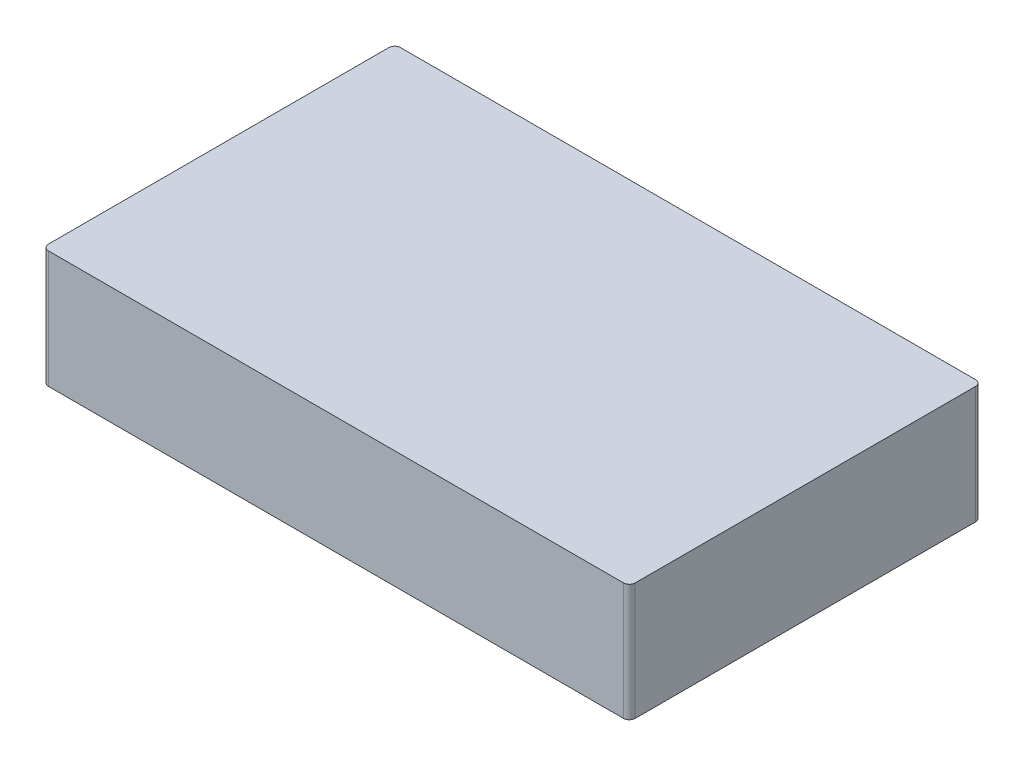
ISO-10303-21;
HEADER;
FILE_DESCRIPTION(('STEP AP214'),'2;1');
FILE_NAME('part.step','',(''),(''),'','','');
FILE_SCHEMA(('AUTOMOTIVE_DESIGN { 1 0 10303 214 1 1 1 1 }'));
ENDSEC;
DATA;
#1=APPLICATION_CONTEXT('core data for automotive mechanical design processes');
#2=APPLICATION_PROTOCOL_DEFINITION('international standard','automotive_design',2000,#1);
#3=PRODUCT_CONTEXT('',#1,'mechanical');
#4=PRODUCT('Part','Part','',(#3));
#5=PRODUCT_RELATED_PRODUCT_CATEGORY('part','',(#4));
#6=PRODUCT_DEFINITION_FORMATION('','',#4);
#7=PRODUCT_DEFINITION_CONTEXT('part definition',#1,'design');
#8=PRODUCT_DEFINITION('design','',#6,#7);
#9=PRODUCT_DEFINITION_SHAPE('','',#8);
#10=(LENGTH_UNIT() NAMED_UNIT(*) SI_UNIT(.MILLI.,.METRE.));
#11=(NAMED_UNIT(*) PLANE_ANGLE_UNIT() SI_UNIT($,.RADIAN.));
#12=(NAMED_UNIT(*) SI_UNIT($,.STERADIAN.) SOLID_ANGLE_UNIT());
#13=UNCERTAINTY_MEASURE_WITH_UNIT(LENGTH_MEASURE(1.E-05),#10,'distance_accuracy_value','');
#14=(GEOMETRIC_REPRESENTATION_CONTEXT(3) GLOBAL_UNCERTAINTY_ASSIGNED_CONTEXT((#13)) GLOBAL_UNIT_ASSIGNED_CONTEXT((#10,
#11,#12)) REPRESENTATION_CONTEXT('',''));
#15=CARTESIAN_POINT('',(0.,0.,0.));
#16=DIRECTION('',(0.,0.,1.));
#17=DIRECTION('',(1.,0.,0.));
#18=AXIS2_PLACEMENT_3D('',#15,#16,#17);
#19=CARTESIAN_POINT('',(49.,20.,-29.));
#20=DIRECTION('',(0.,-1.,0.));
#21=DIRECTION('',(0.,0.,-1.));
#22=AXIS2_PLACEMENT_3D('',#19,#20,#21);
#23=CYLINDRICAL_SURFACE('',#22,1.);
#24=CARTESIAN_POINT('',(49.,0.,-29.));
#25=DIRECTION('',(0.,1.,0.));
#26=DIRECTION('',(0.,0.,1.));
#27=AXIS2_PLACEMENT_3D('',#24,#25,#26);
#28=CIRCLE('',#27,1.);
#29=CARTESIAN_POINT('',(50.,0.,-29.));
#30=VERTEX_POINT('',#29);
#31=CARTESIAN_POINT('',(49.,0.,-30.));
#32=VERTEX_POINT('',#31);
#33=EDGE_CURVE('E140',#30,#32,#28,.T.);
#34=ORIENTED_EDGE('',*,*,#33,.T.);
#35=DIRECTION('',(0.,-1.,0.));
#36=VECTOR('',#35,1.);
#37=CARTESIAN_POINT('',(49.,20.,-30.));
#38=LINE('',#37,#36);
#39=CARTESIAN_POINT('',(49.,20.,-30.));
#40=VERTEX_POINT('',#39);
#41=EDGE_CURVE('E11',#40,#32,#38,.T.);
#42=ORIENTED_EDGE('',*,*,#41,.F.);
#43=CARTESIAN_POINT('',(49.,20.,-29.));
#44=DIRECTION('',(0.,1.,0.));
#45=DIRECTION('',(0.,0.,1.));
#46=AXIS2_PLACEMENT_3D('',#43,#44,#45);
#47=CIRCLE('',#46,1.);
#48=CARTESIAN_POINT('',(50.,20.,-29.));
#49=VERTEX_POINT('',#48);
#50=EDGE_CURVE('E162',#49,#40,#47,.T.);
#51=ORIENTED_EDGE('',*,*,#50,.F.);
#52=DIRECTION('',(0.,-1.,0.));
#53=VECTOR('',#52,1.);
#54=CARTESIAN_POINT('',(50.,20.,-29.));
#55=LINE('',#54,#53);
#56=EDGE_CURVE('E136',#49,#30,#55,.T.);
#57=ORIENTED_EDGE('',*,*,#56,.T.);
#58=EDGE_LOOP('',(#34,#42,#51,#57));
#59=FACE_BOUND('',#58,.T.);
#60=ADVANCED_FACE('F39',(#59),#23,.T.);
#61=CARTESIAN_POINT('',(-49.,20.,-30.));
#62=DIRECTION('',(0.,0.,1.));
#63=DIRECTION('',(1.,0.,0.));
#64=AXIS2_PLACEMENT_3D('',#61,#62,#63);
#65=PLANE('',#64);
#66=DIRECTION('',(-1.,0.,0.));
#67=VECTOR('',#66,1.);
#68=CARTESIAN_POINT('',(-49.,0.,-30.));
#69=LINE('',#68,#67);
#70=CARTESIAN_POINT('',(-49.,0.,-30.));
#71=VERTEX_POINT('',#70);
#72=EDGE_CURVE('E144',#32,#71,#69,.T.);
#73=ORIENTED_EDGE('',*,*,#72,.T.);
#74=DIRECTION('',(0.,-1.,0.));
#75=VECTOR('',#74,1.);
#76=CARTESIAN_POINT('',(-49.,20.,-30.));
#77=LINE('',#76,#75);
#78=CARTESIAN_POINT('',(-49.,20.,-30.));
#79=VERTEX_POINT('',#78);
#80=EDGE_CURVE('E48',#79,#71,#77,.T.);
#81=ORIENTED_EDGE('',*,*,#80,.F.);
#82=DIRECTION('',(-1.,0.,0.));
#83=VECTOR('',#82,1.);
#84=CARTESIAN_POINT('',(-49.,20.,-30.));
#85=LINE('',#84,#83);
#86=EDGE_CURVE('E99',#40,#79,#85,.T.);
#87=ORIENTED_EDGE('',*,*,#86,.F.);
#88=ORIENTED_EDGE('',*,*,#41,.T.);
#89=EDGE_LOOP('',(#73,#81,#87,#88));
#90=FACE_BOUND('',#89,.T.);
#91=ADVANCED_FACE('F208',(#90),#65,.F.);
#92=CARTESIAN_POINT('',(-49.,20.,-29.));
#93=DIRECTION('',(0.,-1.,0.));
#94=DIRECTION('',(0.,0.,-1.));
#95=AXIS2_PLACEMENT_3D('',#92,#93,#94);
#96=CYLINDRICAL_SURFACE('',#95,1.);
#97=CARTESIAN_POINT('',(-49.,0.,-29.));
#98=DIRECTION('',(0.,1.,0.));
#99=DIRECTION('',(0.,0.,1.));
#100=AXIS2_PLACEMENT_3D('',#97,#98,#99);
#101=CIRCLE('',#100,1.);
#102=CARTESIAN_POINT('',(-50.,0.,-29.));
#103=VERTEX_POINT('',#102);
#104=EDGE_CURVE('E147',#71,#103,#101,.T.);
#105=ORIENTED_EDGE('',*,*,#104,.T.);
#106=DIRECTION('',(0.,-1.,0.));
#107=VECTOR('',#106,1.);
#108=CARTESIAN_POINT('',(-50.,20.,-29.));
#109=LINE('',#108,#107);
#110=CARTESIAN_POINT('',(-50.,20.,-29.));
#111=VERTEX_POINT('',#110);
#112=EDGE_CURVE('E173',#111,#103,#109,.T.);
#113=ORIENTED_EDGE('',*,*,#112,.F.);
#114=CARTESIAN_POINT('',(-49.,20.,-29.));
#115=DIRECTION('',(0.,1.,0.));
#116=DIRECTION('',(0.,0.,1.));
#117=AXIS2_PLACEMENT_3D('',#114,#115,#116);
#118=CIRCLE('',#117,1.);
#119=EDGE_CURVE('E183',#79,#111,#118,.T.);
#120=ORIENTED_EDGE('',*,*,#119,.F.);
#121=ORIENTED_EDGE('',*,*,#80,.T.);
#122=EDGE_LOOP('',(#105,#113,#120,#121));
#123=FACE_BOUND('',#122,.T.);
#124=ADVANCED_FACE('F181',(#123),#96,.T.);
#125=CARTESIAN_POINT('',(-50.,20.,-29.));
#126=DIRECTION('',(1.,0.,0.));
#127=DIRECTION('',(0.,0.,-1.));
#128=AXIS2_PLACEMENT_3D('',#125,#126,#127);
#129=PLANE('',#128);
#130=DIRECTION('',(0.,0.,1.));
#131=VECTOR('',#130,1.);
#132=CARTESIAN_POINT('',(-50.,0.,-29.));
#133=LINE('',#132,#131);
#134=CARTESIAN_POINT('',(-50.,0.,29.));
#135=VERTEX_POINT('',#134);
#136=EDGE_CURVE('E150',#103,#135,#133,.T.);
#137=ORIENTED_EDGE('',*,*,#136,.T.);
#138=DIRECTION('',(0.,-1.,0.));
#139=VECTOR('',#138,1.);
#140=CARTESIAN_POINT('',(-50.,20.,29.));
#141=LINE('',#140,#139);
#142=CARTESIAN_POINT('',(-50.,20.,29.));
#143=VERTEX_POINT('',#142);
#144=EDGE_CURVE('E169',#143,#135,#141,.T.);
#145=ORIENTED_EDGE('',*,*,#144,.F.);
#146=DIRECTION('',(0.,0.,1.));
#147=VECTOR('',#146,1.);
#148=CARTESIAN_POINT('',(-50.,20.,-29.));
#149=LINE('',#148,#147);
#150=EDGE_CURVE('E196',#111,#143,#149,.T.);
#151=ORIENTED_EDGE('',*,*,#150,.F.);
#152=ORIENTED_EDGE('',*,*,#112,.T.);
#153=EDGE_LOOP('',(#137,#145,#151,#152));
#154=FACE_BOUND('',#153,.T.);
#155=ADVANCED_FACE('F191',(#154),#129,.F.);
#156=CARTESIAN_POINT('',(-49.,20.,29.));
#157=DIRECTION('',(0.,-1.,0.));
#158=DIRECTION('',(0.,0.,-1.));
#159=AXIS2_PLACEMENT_3D('',#156,#157,#158);
#160=CYLINDRICAL_SURFACE('',#159,1.);
#161=CARTESIAN_POINT('',(-49.,0.,29.));
#162=DIRECTION('',(0.,1.,0.));
#163=DIRECTION('',(0.,0.,1.));
#164=AXIS2_PLACEMENT_3D('',#161,#162,#163);
#165=CIRCLE('',#164,1.);
#166=CARTESIAN_POINT('',(-49.,0.,30.));
#167=VERTEX_POINT('',#166);
#168=EDGE_CURVE('E153',#135,#167,#165,.T.);
#169=ORIENTED_EDGE('',*,*,#168,.T.);
#170=DIRECTION('',(0.,-1.,0.));
#171=VECTOR('',#170,1.);
#172=CARTESIAN_POINT('',(-49.,20.,30.));
#173=LINE('',#172,#171);
#174=CARTESIAN_POINT('',(-49.,20.,30.));
#175=VERTEX_POINT('',#174);
#176=EDGE_CURVE('E129',#175,#167,#173,.T.);
#177=ORIENTED_EDGE('',*,*,#176,.F.);
#178=CARTESIAN_POINT('',(-49.,20.,29.));
#179=DIRECTION('',(0.,1.,0.));
#180=DIRECTION('',(0.,0.,1.));
#181=AXIS2_PLACEMENT_3D('',#178,#179,#180);
#182=CIRCLE('',#181,1.);
#183=EDGE_CURVE('E118',#143,#175,#182,.T.);
#184=ORIENTED_EDGE('',*,*,#183,.F.);
#185=ORIENTED_EDGE('',*,*,#144,.T.);
#186=EDGE_LOOP('',(#169,#177,#184,#185));
#187=FACE_BOUND('',#186,.T.);
#188=ADVANCED_FACE('F194',(#187),#160,.T.);
#189=CARTESIAN_POINT('',(-49.,20.,30.));
#190=DIRECTION('',(0.,0.,-1.));
#191=DIRECTION('',(-1.,0.,0.));
#192=AXIS2_PLACEMENT_3D('',#189,#190,#191);
#193=PLANE('',#192);
#194=DIRECTION('',(1.,0.,0.));
#195=VECTOR('',#194,1.);
#196=CARTESIAN_POINT('',(-49.,0.,30.));
#197=LINE('',#196,#195);
#198=CARTESIAN_POINT('',(49.,0.,30.));
#199=VERTEX_POINT('',#198);
#200=EDGE_CURVE('E127',#167,#199,#197,.T.);
#201=ORIENTED_EDGE('',*,*,#200,.T.);
#202=DIRECTION('',(0.,-1.,0.));
#203=VECTOR('',#202,1.);
#204=CARTESIAN_POINT('',(49.,20.,30.));
#205=LINE('',#204,#203);
#206=CARTESIAN_POINT('',(49.,20.,30.));
#207=VERTEX_POINT('',#206);
#208=EDGE_CURVE('E124',#207,#199,#205,.T.);
#209=ORIENTED_EDGE('',*,*,#208,.F.);
#210=DIRECTION('',(1.,0.,0.));
#211=VECTOR('',#210,1.);
#212=CARTESIAN_POINT('',(-49.,20.,30.));
#213=LINE('',#212,#211);
#214=EDGE_CURVE('E112',#175,#207,#213,.T.);
#215=ORIENTED_EDGE('',*,*,#214,.F.);
#216=ORIENTED_EDGE('',*,*,#176,.T.);
#217=EDGE_LOOP('',(#201,#209,#215,#216));
#218=FACE_BOUND('',#217,.T.);
#219=ADVANCED_FACE('F125',(#218),#193,.F.);
#220=CARTESIAN_POINT('',(49.,20.,29.));
#221=DIRECTION('',(0.,-1.,0.));
#222=DIRECTION('',(0.,0.,-1.));
#223=AXIS2_PLACEMENT_3D('',#220,#221,#222);
#224=CYLINDRICAL_SURFACE('',#223,1.);
#225=CARTESIAN_POINT('',(49.,0.,29.));
#226=DIRECTION('',(0.,1.,0.));
#227=DIRECTION('',(0.,0.,1.));
#228=AXIS2_PLACEMENT_3D('',#225,#226,#227);
#229=CIRCLE('',#228,1.);
#230=CARTESIAN_POINT('',(50.,0.,29.));
#231=VERTEX_POINT('',#230);
#232=EDGE_CURVE('E85',#199,#231,#229,.T.);
#233=ORIENTED_EDGE('',*,*,#232,.T.);
#234=DIRECTION('',(0.,-1.,0.));
#235=VECTOR('',#234,1.);
#236=CARTESIAN_POINT('',(50.,20.,29.));
#237=LINE('',#236,#235);
#238=CARTESIAN_POINT('',(50.,20.,29.));
#239=VERTEX_POINT('',#238);
#240=EDGE_CURVE('E130',#239,#231,#237,.T.);
#241=ORIENTED_EDGE('',*,*,#240,.F.);
#242=CARTESIAN_POINT('',(49.,20.,29.));
#243=DIRECTION('',(0.,1.,0.));
#244=DIRECTION('',(0.,0.,1.));
#245=AXIS2_PLACEMENT_3D('',#242,#243,#244);
#246=CIRCLE('',#245,1.);
#247=EDGE_CURVE('E116',#207,#239,#246,.T.);
#248=ORIENTED_EDGE('',*,*,#247,.F.);
#249=ORIENTED_EDGE('',*,*,#208,.T.);
#250=EDGE_LOOP('',(#233,#241,#248,#249));
#251=FACE_BOUND('',#250,.T.);
#252=ADVANCED_FACE('F132',(#251),#224,.T.);
#253=CARTESIAN_POINT('',(50.,20.,-29.));
#254=DIRECTION('',(-1.,0.,0.));
#255=DIRECTION('',(0.,0.,1.));
#256=AXIS2_PLACEMENT_3D('',#253,#254,#255);
#257=PLANE('',#256);
#258=DIRECTION('',(0.,0.,-1.));
#259=VECTOR('',#258,1.);
#260=CARTESIAN_POINT('',(50.,0.,-29.));
#261=LINE('',#260,#259);
#262=EDGE_CURVE('E91',#231,#30,#261,.T.);
#263=ORIENTED_EDGE('',*,*,#262,.T.);
#264=ORIENTED_EDGE('',*,*,#56,.F.);
#265=DIRECTION('',(0.,0.,-1.));
#266=VECTOR('',#265,1.);
#267=CARTESIAN_POINT('',(50.,20.,-29.));
#268=LINE('',#267,#266);
#269=EDGE_CURVE('E56',#239,#49,#268,.T.);
#270=ORIENTED_EDGE('',*,*,#269,.F.);
#271=ORIENTED_EDGE('',*,*,#240,.T.);
#272=EDGE_LOOP('',(#263,#264,#270,#271));
#273=FACE_BOUND('',#272,.T.);
#274=ADVANCED_FACE('F224',(#273),#257,.F.);
#275=CARTESIAN_POINT('',(49.,20.,-29.));
#276=DIRECTION('',(0.,1.,0.));
#277=DIRECTION('',(0.,0.,1.));
#278=AXIS2_PLACEMENT_3D('',#275,#276,#277);
#279=PLANE('',#278);
#280=ORIENTED_EDGE('',*,*,#50,.T.);
#281=ORIENTED_EDGE('',*,*,#86,.T.);
#282=ORIENTED_EDGE('',*,*,#119,.T.);
#283=ORIENTED_EDGE('',*,*,#150,.T.);
#284=ORIENTED_EDGE('',*,*,#183,.T.);
#285=ORIENTED_EDGE('',*,*,#214,.T.);
#286=ORIENTED_EDGE('',*,*,#247,.T.);
#287=ORIENTED_EDGE('',*,*,#269,.T.);
#288=EDGE_LOOP('',(#280,#281,#282,#283,#284,#285,#286,#287));
#289=FACE_BOUND('',#288,.T.);
#290=ADVANCED_FACE('F114',(#289),#279,.T.);
#291=CARTESIAN_POINT('',(49.,0.,-29.));
#292=DIRECTION('',(0.,1.,0.));
#293=DIRECTION('',(0.,0.,1.));
#294=AXIS2_PLACEMENT_3D('',#291,#292,#293);
#295=PLANE('',#294);
#296=ORIENTED_EDGE('',*,*,#33,.F.);
#297=ORIENTED_EDGE('',*,*,#262,.F.);
#298=ORIENTED_EDGE('',*,*,#232,.F.);
#299=ORIENTED_EDGE('',*,*,#200,.F.);
#300=ORIENTED_EDGE('',*,*,#168,.F.);
#301=ORIENTED_EDGE('',*,*,#136,.F.);
#302=ORIENTED_EDGE('',*,*,#104,.F.);
#303=ORIENTED_EDGE('',*,*,#72,.F.);
#304=EDGE_LOOP('',(#296,#297,#298,#299,#300,#301,#302,#303));
#305=FACE_BOUND('',#304,.T.);
#306=ADVANCED_FACE('F187',(#305),#295,.F.);
#307=CLOSED_SHELL('',(#60,#91,#124,#155,#188,#219,#252,#274,#290,#306));
#308=MANIFOLD_SOLID_BREP('B2',#307);
#309=ADVANCED_BREP_SHAPE_REPRESENTATION('',(#18,#308),#14);
#310=SHAPE_DEFINITION_REPRESENTATION(#9,#309);
ENDSEC;
END-ISO-10303-21;
